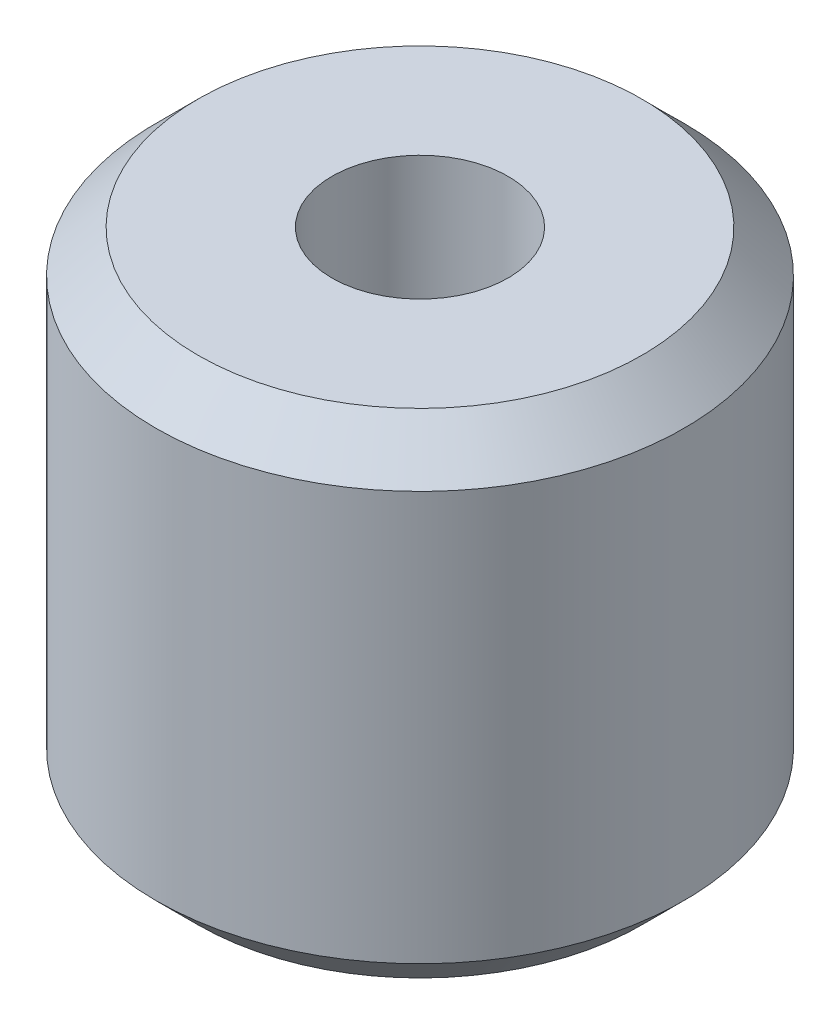
ISO-10303-21;
HEADER;
FILE_DESCRIPTION(('STEP AP214'),'2;1');
FILE_NAME('part.step','',(''),(''),'','','');
FILE_SCHEMA(('AUTOMOTIVE_DESIGN { 1 0 10303 214 1 1 1 1 }'));
ENDSEC;
DATA;
#1=APPLICATION_CONTEXT('core data for automotive mechanical design processes');
#2=APPLICATION_PROTOCOL_DEFINITION('international standard','automotive_design',2000,#1);
#3=PRODUCT_CONTEXT('',#1,'mechanical');
#4=PRODUCT('Part','Part','',(#3));
#5=PRODUCT_RELATED_PRODUCT_CATEGORY('part','',(#4));
#6=PRODUCT_DEFINITION_FORMATION('','',#4);
#7=PRODUCT_DEFINITION_CONTEXT('part definition',#1,'design');
#8=PRODUCT_DEFINITION('design','',#6,#7);
#9=PRODUCT_DEFINITION_SHAPE('','',#8);
#10=(LENGTH_UNIT() NAMED_UNIT(*) SI_UNIT(.MILLI.,.METRE.));
#11=(NAMED_UNIT(*) PLANE_ANGLE_UNIT() SI_UNIT($,.RADIAN.));
#12=(NAMED_UNIT(*) SI_UNIT($,.STERADIAN.) SOLID_ANGLE_UNIT());
#13=UNCERTAINTY_MEASURE_WITH_UNIT(LENGTH_MEASURE(1.E-05),#10,'distance_accuracy_value','');
#14=(GEOMETRIC_REPRESENTATION_CONTEXT(3) GLOBAL_UNCERTAINTY_ASSIGNED_CONTEXT((#13)) GLOBAL_UNIT_ASSIGNED_CONTEXT((#10,
#11,#12)) REPRESENTATION_CONTEXT('',''));
#15=CARTESIAN_POINT('',(0.,0.,0.));
#16=DIRECTION('',(0.,0.,1.));
#17=DIRECTION('',(1.,0.,0.));
#18=AXIS2_PLACEMENT_3D('',#15,#16,#17);
#19=CARTESIAN_POINT('',(0.,4.45,0.));
#20=DIRECTION('',(0.,1.,0.));
#21=DIRECTION('',(0.,0.,1.));
#22=AXIS2_PLACEMENT_3D('',#19,#20,#21);
#23=PLANE('',#22);
#24=CARTESIAN_POINT('',(0.,4.45,0.));
#25=DIRECTION('',(0.,1.,0.));
#26=DIRECTION('',(0.,0.,1.));
#27=AXIS2_PLACEMENT_3D('',#24,#25,#26);
#28=CIRCLE('',#27,4.005);
#29=CARTESIAN_POINT('',(0.,4.45,4.005));
#30=VERTEX_POINT('',#29);
#31=EDGE_CURVE('E10',#30,#30,#28,.T.);
#32=ORIENTED_EDGE('',*,*,#31,.T.);
#33=EDGE_LOOP('',(#32));
#34=FACE_BOUND('',#33,.T.);
#35=CARTESIAN_POINT('',(0.,4.45,0.));
#36=DIRECTION('',(0.,1.,0.));
#37=DIRECTION('',(0.,0.,1.));
#38=AXIS2_PLACEMENT_3D('',#35,#36,#37);
#39=CIRCLE('',#38,1.59);
#40=CARTESIAN_POINT('',(0.,4.45,1.59));
#41=VERTEX_POINT('',#40);
#42=EDGE_CURVE('E70',#41,#41,#39,.T.);
#43=ORIENTED_EDGE('',*,*,#42,.F.);
#44=EDGE_LOOP('',(#43));
#45=FACE_BOUND('',#44,.T.);
#46=ADVANCED_FACE('F45',(#34,#45),#23,.T.);
#47=CARTESIAN_POINT('',(0.,-4.45,0.));
#48=DIRECTION('',(0.,1.,0.));
#49=DIRECTION('',(0.,0.,1.));
#50=AXIS2_PLACEMENT_3D('',#47,#48,#49);
#51=PLANE('',#50);
#52=CARTESIAN_POINT('',(0.,-4.45,0.));
#53=DIRECTION('',(0.,1.,0.));
#54=DIRECTION('',(0.,0.,1.));
#55=AXIS2_PLACEMENT_3D('',#52,#53,#54);
#56=CIRCLE('',#55,4.00499999999999);
#57=CARTESIAN_POINT('',(0.,-4.45,4.00499999999999));
#58=VERTEX_POINT('',#57);
#59=EDGE_CURVE('E54',#58,#58,#56,.F.);
#60=ORIENTED_EDGE('',*,*,#59,.T.);
#61=EDGE_LOOP('',(#60));
#62=FACE_BOUND('',#61,.T.);
#63=CARTESIAN_POINT('',(0.,-4.45,0.));
#64=DIRECTION('',(0.,1.,0.));
#65=DIRECTION('',(0.,0.,1.));
#66=AXIS2_PLACEMENT_3D('',#63,#64,#65);
#67=CIRCLE('',#66,1.59);
#68=CARTESIAN_POINT('',(0.,-4.45,1.59));
#69=VERTEX_POINT('',#68);
#70=EDGE_CURVE('E71',#69,#69,#67,.T.);
#71=ORIENTED_EDGE('',*,*,#70,.T.);
#72=EDGE_LOOP('',(#71));
#73=FACE_BOUND('',#72,.T.);
#74=ADVANCED_FACE('F83',(#62,#73),#51,.F.);
#75=CARTESIAN_POINT('',(0.,4.45,0.));
#76=DIRECTION('',(0.,-1.,0.));
#77=DIRECTION('',(0.,0.,-1.));
#78=AXIS2_PLACEMENT_3D('',#75,#76,#77);
#79=CYLINDRICAL_SURFACE('',#78,4.765);
#80=CARTESIAN_POINT('',(0.,-3.69,0.));
#81=DIRECTION('',(0.,1.,0.));
#82=DIRECTION('',(0.,0.,1.));
#83=AXIS2_PLACEMENT_3D('',#80,#81,#82);
#84=CIRCLE('',#83,4.765);
#85=CARTESIAN_POINT('',(0.,-3.69,4.765));
#86=VERTEX_POINT('',#85);
#87=EDGE_CURVE('E59',#86,#86,#84,.T.);
#88=ORIENTED_EDGE('',*,*,#87,.T.);
#89=EDGE_LOOP('',(#88));
#90=FACE_BOUND('',#89,.T.);
#91=CARTESIAN_POINT('',(0.,3.69,0.));
#92=DIRECTION('',(0.,1.,0.));
#93=DIRECTION('',(0.,0.,1.));
#94=AXIS2_PLACEMENT_3D('',#91,#92,#93);
#95=CIRCLE('',#94,4.765);
#96=CARTESIAN_POINT('',(0.,3.69,4.765));
#97=VERTEX_POINT('',#96);
#98=EDGE_CURVE('E64',#97,#97,#95,.F.);
#99=ORIENTED_EDGE('',*,*,#98,.T.);
#100=EDGE_LOOP('',(#99));
#101=FACE_BOUND('',#100,.T.);
#102=ADVANCED_FACE('F89',(#90,#101),#79,.T.);
#103=CARTESIAN_POINT('',(0.,4.45,0.));
#104=DIRECTION('',(0.,-1.,0.));
#105=DIRECTION('',(0.,0.,-1.));
#106=AXIS2_PLACEMENT_3D('',#103,#104,#105);
#107=CYLINDRICAL_SURFACE('',#106,1.59);
#108=ORIENTED_EDGE('',*,*,#42,.T.);
#109=EDGE_LOOP('',(#108));
#110=FACE_BOUND('',#109,.T.);
#111=ORIENTED_EDGE('',*,*,#70,.F.);
#112=EDGE_LOOP('',(#111));
#113=FACE_BOUND('',#112,.T.);
#114=ADVANCED_FACE('F79',(#110,#113),#107,.F.);
#115=CARTESIAN_POINT('',(0.,-3.69,0.));
#116=DIRECTION('',(0.,1.,0.));
#117=DIRECTION('',(0.,0.,1.));
#118=AXIS2_PLACEMENT_3D('',#115,#116,#117);
#119=CONICAL_SURFACE('',#118,4.765,0.78539816339745);
#120=ORIENTED_EDGE('',*,*,#59,.F.);
#121=EDGE_LOOP('',(#120));
#122=FACE_BOUND('',#121,.T.);
#123=ORIENTED_EDGE('',*,*,#87,.F.);
#124=EDGE_LOOP('',(#123));
#125=FACE_BOUND('',#124,.T.);
#126=ADVANCED_FACE('F96',(#122,#125),#119,.T.);
#127=CARTESIAN_POINT('',(0.,4.45,0.));
#128=DIRECTION('',(0.,-1.,0.));
#129=DIRECTION('',(0.,0.,-1.));
#130=AXIS2_PLACEMENT_3D('',#127,#128,#129);
#131=CONICAL_SURFACE('',#130,4.005,0.785398163397447);
#132=ORIENTED_EDGE('',*,*,#98,.F.);
#133=EDGE_LOOP('',(#132));
#134=FACE_BOUND('',#133,.T.);
#135=ORIENTED_EDGE('',*,*,#31,.F.);
#136=EDGE_LOOP('',(#135));
#137=FACE_BOUND('',#136,.T.);
#138=ADVANCED_FACE('F48',(#134,#137),#131,.T.);
#139=CLOSED_SHELL('',(#46,#74,#102,#114,#126,#138));
#140=MANIFOLD_SOLID_BREP('B2',#139);
#141=ADVANCED_BREP_SHAPE_REPRESENTATION('',(#18,#140),#14);
#142=SHAPE_DEFINITION_REPRESENTATION(#9,#141);
ENDSEC;
END-ISO-10303-21;
